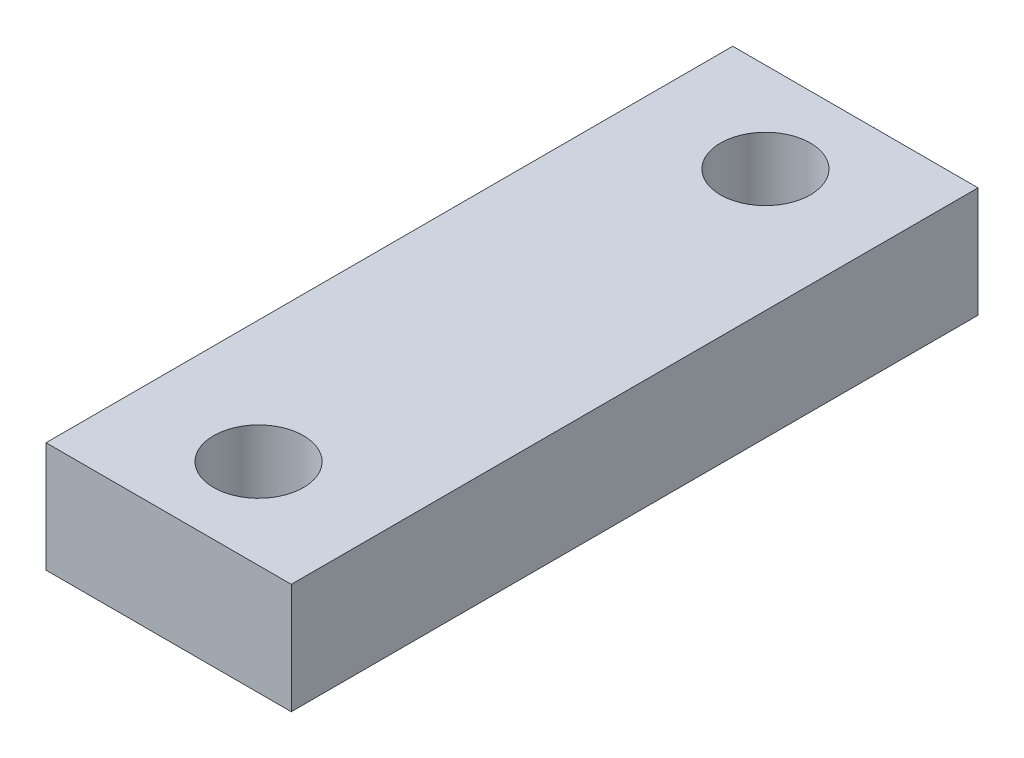
ISO-10303-21;
HEADER;
FILE_DESCRIPTION(('STEP AP214'),'2;1');
FILE_NAME('part.step','',(''),(''),'','','');
FILE_SCHEMA(('AUTOMOTIVE_DESIGN { 1 0 10303 214 1 1 1 1 }'));
ENDSEC;
DATA;
#1=APPLICATION_CONTEXT('core data for automotive mechanical design processes');
#2=APPLICATION_PROTOCOL_DEFINITION('international standard','automotive_design',2000,#1);
#3=PRODUCT_CONTEXT('',#1,'mechanical');
#4=PRODUCT('Part','Part','',(#3));
#5=PRODUCT_RELATED_PRODUCT_CATEGORY('part','',(#4));
#6=PRODUCT_DEFINITION_FORMATION('','',#4);
#7=PRODUCT_DEFINITION_CONTEXT('part definition',#1,'design');
#8=PRODUCT_DEFINITION('design','',#6,#7);
#9=PRODUCT_DEFINITION_SHAPE('','',#8);
#10=(LENGTH_UNIT() NAMED_UNIT(*) SI_UNIT(.MILLI.,.METRE.));
#11=(NAMED_UNIT(*) PLANE_ANGLE_UNIT() SI_UNIT($,.RADIAN.));
#12=(NAMED_UNIT(*) SI_UNIT($,.STERADIAN.) SOLID_ANGLE_UNIT());
#13=UNCERTAINTY_MEASURE_WITH_UNIT(LENGTH_MEASURE(1.E-05),#10,'distance_accuracy_value','');
#14=(GEOMETRIC_REPRESENTATION_CONTEXT(3) GLOBAL_UNCERTAINTY_ASSIGNED_CONTEXT((#13)) GLOBAL_UNIT_ASSIGNED_CONTEXT((#10,
#11,#12)) REPRESENTATION_CONTEXT('',''));
#15=CARTESIAN_POINT('',(0.,0.,0.));
#16=DIRECTION('',(0.,0.,1.));
#17=DIRECTION('',(1.,0.,0.));
#18=AXIS2_PLACEMENT_3D('',#15,#16,#17);
#19=CARTESIAN_POINT('',(15.,6.75,0.));
#20=DIRECTION('',(0.,0.,-1.));
#21=DIRECTION('',(0.,1.,0.));
#22=AXIS2_PLACEMENT_3D('',#19,#20,#21);
#23=PLANE('',#22);
#24=DIRECTION('',(0.,-1.,0.));
#25=VECTOR('',#24,1.);
#26=CARTESIAN_POINT('',(0.,6.75,0.));
#27=LINE('',#26,#25);
#28=CARTESIAN_POINT('',(0.,6.75,0.));
#29=VERTEX_POINT('',#28);
#30=CARTESIAN_POINT('',(0.,0.,0.));
#31=VERTEX_POINT('',#30);
#32=EDGE_CURVE('E102',#29,#31,#27,.T.);
#33=ORIENTED_EDGE('',*,*,#32,.T.);
#34=DIRECTION('',(-1.,0.,0.));
#35=VECTOR('',#34,1.);
#36=CARTESIAN_POINT('',(15.,0.,0.));
#37=LINE('',#36,#35);
#38=CARTESIAN_POINT('',(15.,0.,0.));
#39=VERTEX_POINT('',#38);
#40=EDGE_CURVE('E11',#39,#31,#37,.T.);
#41=ORIENTED_EDGE('',*,*,#40,.F.);
#42=DIRECTION('',(0.,-1.,0.));
#43=VECTOR('',#42,1.);
#44=CARTESIAN_POINT('',(15.,6.75,0.));
#45=LINE('',#44,#43);
#46=CARTESIAN_POINT('',(15.,6.75,0.));
#47=VERTEX_POINT('',#46);
#48=EDGE_CURVE('E90',#47,#39,#45,.T.);
#49=ORIENTED_EDGE('',*,*,#48,.F.);
#50=DIRECTION('',(-1.,0.,0.));
#51=VECTOR('',#50,1.);
#52=CARTESIAN_POINT('',(15.,6.75,0.));
#53=LINE('',#52,#51);
#54=EDGE_CURVE('E98',#47,#29,#53,.T.);
#55=ORIENTED_EDGE('',*,*,#54,.T.);
#56=EDGE_LOOP('',(#33,#41,#49,#55));
#57=FACE_BOUND('',#56,.T.);
#58=ADVANCED_FACE('F39',(#57),#23,.F.);
#59=CARTESIAN_POINT('',(15.,0.,0.));
#60=DIRECTION('',(0.,1.,0.));
#61=DIRECTION('',(0.,0.,1.));
#62=AXIS2_PLACEMENT_3D('',#59,#60,#61);
#63=PLANE('',#62);
#64=CARTESIAN_POINT('',(7.5,0.,-5.5));
#65=DIRECTION('',(0.,1.,0.));
#66=DIRECTION('',(0.,0.,1.));
#67=AXIS2_PLACEMENT_3D('',#64,#65,#66);
#68=CIRCLE('',#67,2.75);
#69=CARTESIAN_POINT('',(7.5,0.,-2.75));
#70=VERTEX_POINT('',#69);
#71=EDGE_CURVE('E105',#70,#70,#68,.T.);
#72=ORIENTED_EDGE('',*,*,#71,.T.);
#73=EDGE_LOOP('',(#72));
#74=FACE_BOUND('',#73,.T.);
#75=CARTESIAN_POINT('',(7.5,0.,-36.5));
#76=DIRECTION('',(0.,1.,0.));
#77=DIRECTION('',(0.,0.,1.));
#78=AXIS2_PLACEMENT_3D('',#75,#76,#77);
#79=CIRCLE('',#78,2.75);
#80=CARTESIAN_POINT('',(7.5,0.,-33.75));
#81=VERTEX_POINT('',#80);
#82=EDGE_CURVE('E116',#81,#81,#79,.T.);
#83=ORIENTED_EDGE('',*,*,#82,.T.);
#84=EDGE_LOOP('',(#83));
#85=FACE_BOUND('',#84,.T.);
#86=DIRECTION('',(0.,0.,-1.));
#87=VECTOR('',#86,1.);
#88=CARTESIAN_POINT('',(0.,0.,0.));
#89=LINE('',#88,#87);
#90=CARTESIAN_POINT('',(0.,0.,-42.));
#91=VERTEX_POINT('',#90);
#92=EDGE_CURVE('E94',#31,#91,#89,.T.);
#93=ORIENTED_EDGE('',*,*,#92,.T.);
#94=DIRECTION('',(-1.,0.,0.));
#95=VECTOR('',#94,1.);
#96=CARTESIAN_POINT('',(15.,0.,-42.));
#97=LINE('',#96,#95);
#98=CARTESIAN_POINT('',(15.,0.,-42.));
#99=VERTEX_POINT('',#98);
#100=EDGE_CURVE('E47',#99,#91,#97,.T.);
#101=ORIENTED_EDGE('',*,*,#100,.F.);
#102=DIRECTION('',(0.,0.,-1.));
#103=VECTOR('',#102,1.);
#104=CARTESIAN_POINT('',(15.,0.,0.));
#105=LINE('',#104,#103);
#106=EDGE_CURVE('E85',#39,#99,#105,.T.);
#107=ORIENTED_EDGE('',*,*,#106,.F.);
#108=ORIENTED_EDGE('',*,*,#40,.T.);
#109=EDGE_LOOP('',(#93,#101,#107,#108));
#110=FACE_BOUND('',#109,.T.);
#111=ADVANCED_FACE('F93',(#74,#85,#110),#63,.F.);
#112=CARTESIAN_POINT('',(15.,0.,-42.));
#113=DIRECTION('',(0.,0.,1.));
#114=DIRECTION('',(1.,0.,0.));
#115=AXIS2_PLACEMENT_3D('',#112,#113,#114);
#116=PLANE('',#115);
#117=DIRECTION('',(0.,1.,0.));
#118=VECTOR('',#117,1.);
#119=CARTESIAN_POINT('',(0.,0.,-42.));
#120=LINE('',#119,#118);
#121=CARTESIAN_POINT('',(0.,6.75000000000001,-42.));
#122=VERTEX_POINT('',#121);
#123=EDGE_CURVE('E72',#91,#122,#120,.T.);
#124=ORIENTED_EDGE('',*,*,#123,.T.);
#125=DIRECTION('',(-1.,0.,0.));
#126=VECTOR('',#125,1.);
#127=CARTESIAN_POINT('',(15.,6.75000000000001,-42.));
#128=LINE('',#127,#126);
#129=CARTESIAN_POINT('',(15.,6.75000000000001,-42.));
#130=VERTEX_POINT('',#129);
#131=EDGE_CURVE('E95',#130,#122,#128,.T.);
#132=ORIENTED_EDGE('',*,*,#131,.F.);
#133=DIRECTION('',(0.,1.,0.));
#134=VECTOR('',#133,1.);
#135=CARTESIAN_POINT('',(15.,0.,-42.));
#136=LINE('',#135,#134);
#137=EDGE_CURVE('E88',#99,#130,#136,.T.);
#138=ORIENTED_EDGE('',*,*,#137,.F.);
#139=ORIENTED_EDGE('',*,*,#100,.T.);
#140=EDGE_LOOP('',(#124,#132,#138,#139));
#141=FACE_BOUND('',#140,.T.);
#142=ADVANCED_FACE('F96',(#141),#116,.F.);
#143=CARTESIAN_POINT('',(15.,6.75000000000001,-42.));
#144=DIRECTION('',(0.,-1.,0.));
#145=DIRECTION('',(0.,0.,-1.));
#146=AXIS2_PLACEMENT_3D('',#143,#144,#145);
#147=PLANE('',#146);
#148=CARTESIAN_POINT('',(7.5,6.75,-5.5));
#149=DIRECTION('',(0.,1.,0.));
#150=DIRECTION('',(0.,0.,1.));
#151=AXIS2_PLACEMENT_3D('',#148,#149,#150);
#152=CIRCLE('',#151,2.75);
#153=CARTESIAN_POINT('',(7.5,6.75,-2.75));
#154=VERTEX_POINT('',#153);
#155=EDGE_CURVE('E122',#154,#154,#152,.T.);
#156=ORIENTED_EDGE('',*,*,#155,.F.);
#157=EDGE_LOOP('',(#156));
#158=FACE_BOUND('',#157,.T.);
#159=CARTESIAN_POINT('',(7.5,6.75000000000001,-36.5));
#160=DIRECTION('',(0.,1.,0.));
#161=DIRECTION('',(0.,0.,1.));
#162=AXIS2_PLACEMENT_3D('',#159,#160,#161);
#163=CIRCLE('',#162,2.75);
#164=CARTESIAN_POINT('',(7.5,6.75000000000001,-33.75));
#165=VERTEX_POINT('',#164);
#166=EDGE_CURVE('E119',#165,#165,#163,.T.);
#167=ORIENTED_EDGE('',*,*,#166,.F.);
#168=EDGE_LOOP('',(#167));
#169=FACE_BOUND('',#168,.T.);
#170=DIRECTION('',(0.,0.,1.));
#171=VECTOR('',#170,1.);
#172=CARTESIAN_POINT('',(0.,6.75000000000001,-42.));
#173=LINE('',#172,#171);
#174=EDGE_CURVE('E78',#122,#29,#173,.T.);
#175=ORIENTED_EDGE('',*,*,#174,.T.);
#176=ORIENTED_EDGE('',*,*,#54,.F.);
#177=DIRECTION('',(0.,0.,1.));
#178=VECTOR('',#177,1.);
#179=CARTESIAN_POINT('',(15.,6.75000000000001,-42.));
#180=LINE('',#179,#178);
#181=EDGE_CURVE('E55',#130,#47,#180,.T.);
#182=ORIENTED_EDGE('',*,*,#181,.F.);
#183=ORIENTED_EDGE('',*,*,#131,.T.);
#184=EDGE_LOOP('',(#175,#176,#182,#183));
#185=FACE_BOUND('',#184,.T.);
#186=ADVANCED_FACE('F110',(#158,#169,#185),#147,.F.);
#187=CARTESIAN_POINT('',(15.,0.,0.));
#188=DIRECTION('',(1.,0.,0.));
#189=DIRECTION('',(0.,0.,-1.));
#190=AXIS2_PLACEMENT_3D('',#187,#188,#189);
#191=PLANE('',#190);
#192=ORIENTED_EDGE('',*,*,#48,.T.);
#193=ORIENTED_EDGE('',*,*,#106,.T.);
#194=ORIENTED_EDGE('',*,*,#137,.T.);
#195=ORIENTED_EDGE('',*,*,#181,.T.);
#196=EDGE_LOOP('',(#192,#193,#194,#195));
#197=FACE_BOUND('',#196,.T.);
#198=ADVANCED_FACE('F86',(#197),#191,.T.);
#199=CARTESIAN_POINT('',(0.,0.,0.));
#200=DIRECTION('',(1.,0.,0.));
#201=DIRECTION('',(0.,0.,-1.));
#202=AXIS2_PLACEMENT_3D('',#199,#200,#201);
#203=PLANE('',#202);
#204=ORIENTED_EDGE('',*,*,#32,.F.);
#205=ORIENTED_EDGE('',*,*,#174,.F.);
#206=ORIENTED_EDGE('',*,*,#123,.F.);
#207=ORIENTED_EDGE('',*,*,#92,.F.);
#208=EDGE_LOOP('',(#204,#205,#206,#207));
#209=FACE_BOUND('',#208,.T.);
#210=ADVANCED_FACE('F113',(#209),#203,.F.);
#211=CARTESIAN_POINT('',(7.5,0.,-36.5));
#212=DIRECTION('',(0.,1.,0.));
#213=DIRECTION('',(0.,0.,1.));
#214=AXIS2_PLACEMENT_3D('',#211,#212,#213);
#215=CYLINDRICAL_SURFACE('',#214,2.75);
#216=ORIENTED_EDGE('',*,*,#82,.F.);
#217=EDGE_LOOP('',(#216));
#218=FACE_BOUND('',#217,.T.);
#219=ORIENTED_EDGE('',*,*,#166,.T.);
#220=EDGE_LOOP('',(#219));
#221=FACE_BOUND('',#220,.T.);
#222=ADVANCED_FACE('F133',(#218,#221),#215,.F.);
#223=CARTESIAN_POINT('',(7.5,0.,-5.5));
#224=DIRECTION('',(0.,1.,0.));
#225=DIRECTION('',(0.,0.,1.));
#226=AXIS2_PLACEMENT_3D('',#223,#224,#225);
#227=CYLINDRICAL_SURFACE('',#226,2.75);
#228=ORIENTED_EDGE('',*,*,#71,.F.);
#229=EDGE_LOOP('',(#228));
#230=FACE_BOUND('',#229,.T.);
#231=ORIENTED_EDGE('',*,*,#155,.T.);
#232=EDGE_LOOP('',(#231));
#233=FACE_BOUND('',#232,.T.);
#234=ADVANCED_FACE('F130',(#230,#233),#227,.F.);
#235=CLOSED_SHELL('',(#58,#111,#142,#186,#198,#210,#222,#234));
#236=MANIFOLD_SOLID_BREP('B2',#235);
#237=ADVANCED_BREP_SHAPE_REPRESENTATION('',(#18,#236),#14);
#238=SHAPE_DEFINITION_REPRESENTATION(#9,#237);
ENDSEC;
END-ISO-10303-21;
